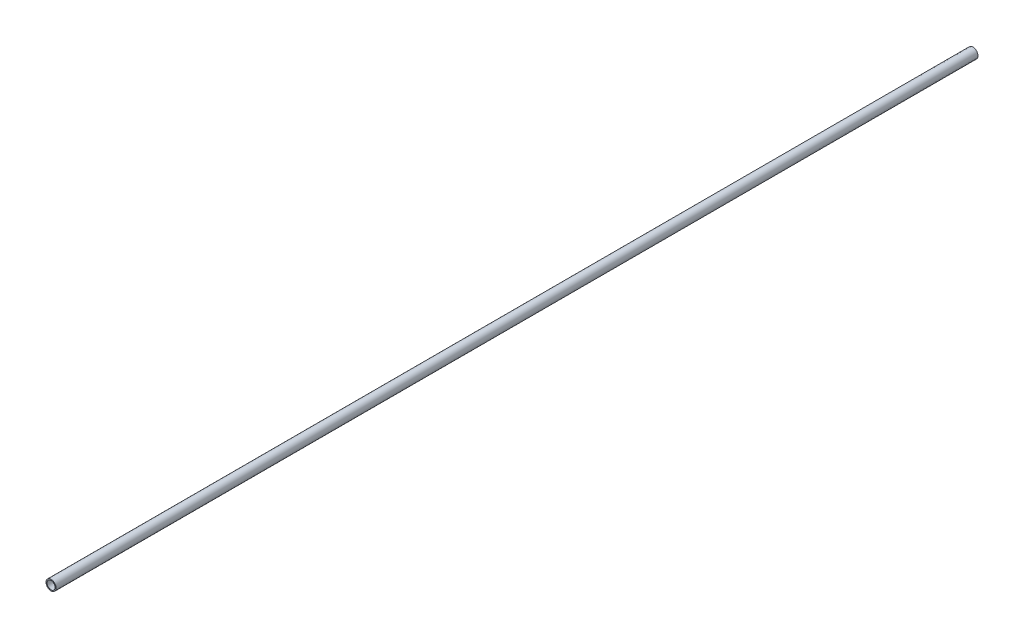
ISO-10303-21;
HEADER;
FILE_DESCRIPTION(('STEP AP214'),'2;1');
FILE_NAME('part.step','',(''),(''),'','','');
FILE_SCHEMA(('AUTOMOTIVE_DESIGN { 1 0 10303 214 1 1 1 1 }'));
ENDSEC;
DATA;
#1=APPLICATION_CONTEXT('core data for automotive mechanical design processes');
#2=APPLICATION_PROTOCOL_DEFINITION('international standard','automotive_design',2000,#1);
#3=PRODUCT_CONTEXT('',#1,'mechanical');
#4=PRODUCT('Part','Part','',(#3));
#5=PRODUCT_RELATED_PRODUCT_CATEGORY('part','',(#4));
#6=PRODUCT_DEFINITION_FORMATION('','',#4);
#7=PRODUCT_DEFINITION_CONTEXT('part definition',#1,'design');
#8=PRODUCT_DEFINITION('design','',#6,#7);
#9=PRODUCT_DEFINITION_SHAPE('','',#8);
#10=(LENGTH_UNIT() NAMED_UNIT(*) SI_UNIT(.MILLI.,.METRE.));
#11=(NAMED_UNIT(*) PLANE_ANGLE_UNIT() SI_UNIT($,.RADIAN.));
#12=(NAMED_UNIT(*) SI_UNIT($,.STERADIAN.) SOLID_ANGLE_UNIT());
#13=UNCERTAINTY_MEASURE_WITH_UNIT(LENGTH_MEASURE(1.E-05),#10,'distance_accuracy_value','');
#14=(GEOMETRIC_REPRESENTATION_CONTEXT(3) GLOBAL_UNCERTAINTY_ASSIGNED_CONTEXT((#13)) GLOBAL_UNIT_ASSIGNED_CONTEXT((#10,
#11,#12)) REPRESENTATION_CONTEXT('',''));
#15=CARTESIAN_POINT('',(0.,0.,0.));
#16=DIRECTION('',(0.,0.,1.));
#17=DIRECTION('',(1.,0.,0.));
#18=AXIS2_PLACEMENT_3D('',#15,#16,#17);
#19=CARTESIAN_POINT('',(0.,0.,1524.));
#20=DIRECTION('',(0.,0.,1.));
#21=DIRECTION('',(1.,0.,0.));
#22=AXIS2_PLACEMENT_3D('',#19,#20,#21);
#23=PLANE('',#22);
#24=CARTESIAN_POINT('',(0.,0.,1524.));
#25=DIRECTION('',(0.,0.,1.));
#26=DIRECTION('',(1.,0.,0.));
#27=AXIS2_PLACEMENT_3D('',#24,#25,#26);
#28=CIRCLE('',#27,16.7005);
#29=CARTESIAN_POINT('',(16.7005,0.,1524.));
#30=VERTEX_POINT('',#29);
#31=EDGE_CURVE('E11',#30,#30,#28,.T.);
#32=ORIENTED_EDGE('',*,*,#31,.T.);
#33=EDGE_LOOP('',(#32));
#34=FACE_BOUND('',#33,.T.);
#35=CARTESIAN_POINT('',(0.,0.,1524.));
#36=DIRECTION('',(0.,0.,1.));
#37=DIRECTION('',(1.,0.,0.));
#38=AXIS2_PLACEMENT_3D('',#35,#36,#37);
#39=CIRCLE('',#38,13.3223);
#40=CARTESIAN_POINT('',(13.3223,0.,1524.));
#41=VERTEX_POINT('',#40);
#42=EDGE_CURVE('E46',#41,#41,#39,.T.);
#43=ORIENTED_EDGE('',*,*,#42,.F.);
#44=EDGE_LOOP('',(#43));
#45=FACE_BOUND('',#44,.T.);
#46=ADVANCED_FACE('F35',(#34,#45),#23,.T.);
#47=CARTESIAN_POINT('',(0.,0.,-1524.));
#48=DIRECTION('',(0.,0.,1.));
#49=DIRECTION('',(1.,0.,0.));
#50=AXIS2_PLACEMENT_3D('',#47,#48,#49);
#51=PLANE('',#50);
#52=CARTESIAN_POINT('',(0.,0.,-1524.));
#53=DIRECTION('',(0.,0.,1.));
#54=DIRECTION('',(1.,0.,0.));
#55=AXIS2_PLACEMENT_3D('',#52,#53,#54);
#56=CIRCLE('',#55,16.7005);
#57=CARTESIAN_POINT('',(16.7005,0.,-1524.));
#58=VERTEX_POINT('',#57);
#59=EDGE_CURVE('E39',#58,#58,#56,.T.);
#60=ORIENTED_EDGE('',*,*,#59,.F.);
#61=EDGE_LOOP('',(#60));
#62=FACE_BOUND('',#61,.T.);
#63=CARTESIAN_POINT('',(0.,0.,-1524.));
#64=DIRECTION('',(0.,0.,1.));
#65=DIRECTION('',(1.,0.,0.));
#66=AXIS2_PLACEMENT_3D('',#63,#64,#65);
#67=CIRCLE('',#66,13.3223);
#68=CARTESIAN_POINT('',(13.3223,0.,-1524.));
#69=VERTEX_POINT('',#68);
#70=EDGE_CURVE('E48',#69,#69,#67,.T.);
#71=ORIENTED_EDGE('',*,*,#70,.T.);
#72=EDGE_LOOP('',(#71));
#73=FACE_BOUND('',#72,.T.);
#74=ADVANCED_FACE('F58',(#62,#73),#51,.F.);
#75=CARTESIAN_POINT('',(0.,0.,1524.));
#76=DIRECTION('',(0.,0.,-1.));
#77=DIRECTION('',(-1.,0.,0.));
#78=AXIS2_PLACEMENT_3D('',#75,#76,#77);
#79=CYLINDRICAL_SURFACE('',#78,16.7005);
#80=ORIENTED_EDGE('',*,*,#31,.F.);
#81=EDGE_LOOP('',(#80));
#82=FACE_BOUND('',#81,.T.);
#83=ORIENTED_EDGE('',*,*,#59,.T.);
#84=EDGE_LOOP('',(#83));
#85=FACE_BOUND('',#84,.T.);
#86=ADVANCED_FACE('F37',(#82,#85),#79,.T.);
#87=CARTESIAN_POINT('',(0.,0.,1524.));
#88=DIRECTION('',(0.,0.,-1.));
#89=DIRECTION('',(-1.,0.,0.));
#90=AXIS2_PLACEMENT_3D('',#87,#88,#89);
#91=CYLINDRICAL_SURFACE('',#90,13.3223);
#92=ORIENTED_EDGE('',*,*,#42,.T.);
#93=EDGE_LOOP('',(#92));
#94=FACE_BOUND('',#93,.T.);
#95=ORIENTED_EDGE('',*,*,#70,.F.);
#96=EDGE_LOOP('',(#95));
#97=FACE_BOUND('',#96,.T.);
#98=ADVANCED_FACE('F54',(#94,#97),#91,.F.);
#99=CLOSED_SHELL('',(#46,#74,#86,#98));
#100=MANIFOLD_SOLID_BREP('B2',#99);
#101=ADVANCED_BREP_SHAPE_REPRESENTATION('',(#18,#100),#14);
#102=SHAPE_DEFINITION_REPRESENTATION(#9,#101);
ENDSEC;
END-ISO-10303-21;
